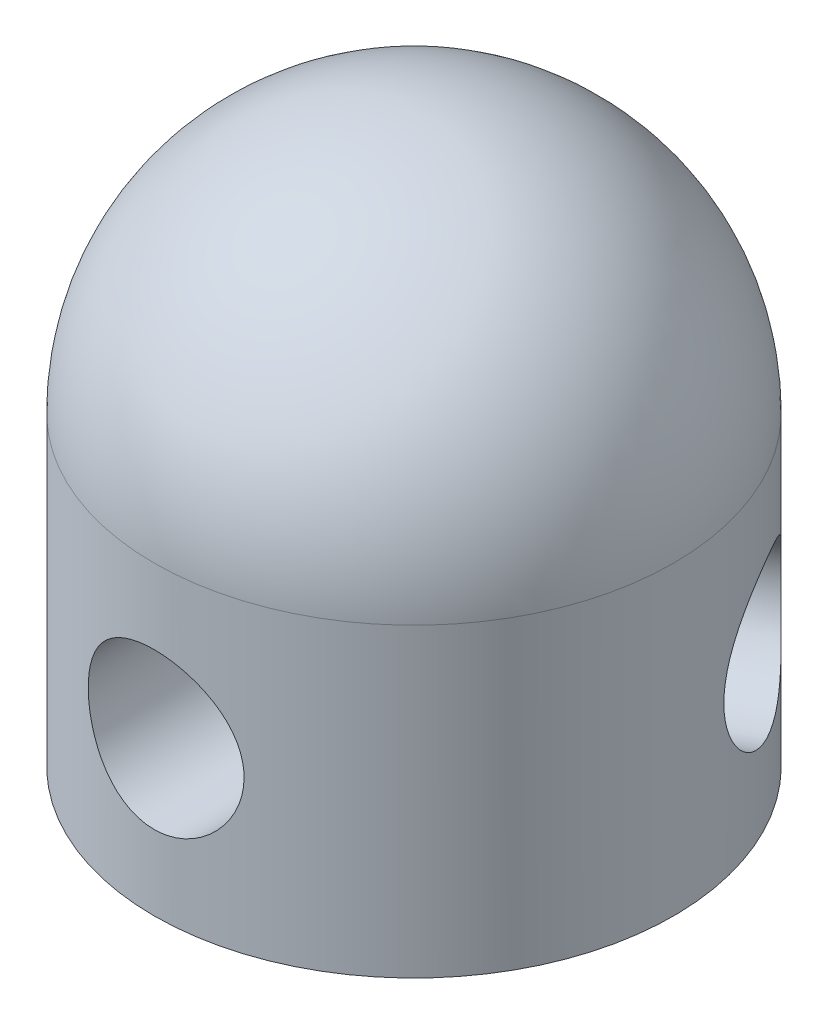
ISO-10303-21;
HEADER;
FILE_DESCRIPTION(('STEP AP214'),'2;1');
FILE_NAME('part.step','',(''),(''),'','','');
FILE_SCHEMA(('AUTOMOTIVE_DESIGN { 1 0 10303 214 1 1 1 1 }'));
ENDSEC;
DATA;
#1=APPLICATION_CONTEXT('core data for automotive mechanical design processes');
#2=APPLICATION_PROTOCOL_DEFINITION('international standard','automotive_design',2000,#1);
#3=PRODUCT_CONTEXT('',#1,'mechanical');
#4=PRODUCT('Part','Part','',(#3));
#5=PRODUCT_RELATED_PRODUCT_CATEGORY('part','',(#4));
#6=PRODUCT_DEFINITION_FORMATION('','',#4);
#7=PRODUCT_DEFINITION_CONTEXT('part definition',#1,'design');
#8=PRODUCT_DEFINITION('design','',#6,#7);
#9=PRODUCT_DEFINITION_SHAPE('','',#8);
#10=(LENGTH_UNIT() NAMED_UNIT(*) SI_UNIT(.MILLI.,.METRE.));
#11=(NAMED_UNIT(*) PLANE_ANGLE_UNIT() SI_UNIT($,.RADIAN.));
#12=(NAMED_UNIT(*) SI_UNIT($,.STERADIAN.) SOLID_ANGLE_UNIT());
#13=UNCERTAINTY_MEASURE_WITH_UNIT(LENGTH_MEASURE(1.E-05),#10,'distance_accuracy_value','');
#14=(GEOMETRIC_REPRESENTATION_CONTEXT(3) GLOBAL_UNCERTAINTY_ASSIGNED_CONTEXT((#13)) GLOBAL_UNIT_ASSIGNED_CONTEXT((#10,
#11,#12)) REPRESENTATION_CONTEXT('',''));
#15=CARTESIAN_POINT('',(0.,0.,0.));
#16=DIRECTION('',(0.,0.,1.));
#17=DIRECTION('',(1.,0.,0.));
#18=AXIS2_PLACEMENT_3D('',#15,#16,#17);
#19=CARTESIAN_POINT('',(0.,20.,0.));
#20=DIRECTION('',(0.,-1.,0.));
#21=DIRECTION('',(0.,0.,-1.));
#22=AXIS2_PLACEMENT_3D('',#19,#20,#21);
#23=CYLINDRICAL_SURFACE('',#22,17.);
#24=CARTESIAN_POINT('',(11.4943048955795,10.,-12.5252127713447));
#25=CARTESIAN_POINT('',(11.4943091391889,9.72053853699297,-12.5252112025164));
#26=CARTESIAN_POINT('',(11.5121535043202,9.44104263790955,-12.5089037602181));
#27=CARTESIAN_POINT('',(11.582323652573,8.89022215138816,-12.4439542886179));
#28=CARTESIAN_POINT('',(11.6346609568794,8.61890032589522,-12.3953014553984));
#29=CARTESIAN_POINT('',(11.7703119951408,8.09248192387591,-12.266556572506));
#30=CARTESIAN_POINT('',(11.8535742009086,7.83735917924745,-12.1865168085596));
#31=CARTESIAN_POINT('',(12.046230903556,7.34928542441603,-11.996107448568));
#32=CARTESIAN_POINT('',(12.1556293122564,7.11633774047292,-11.8857333119874));
#33=CARTESIAN_POINT('',(12.3983275906579,6.67185427203691,-11.6324133127298));
#34=CARTESIAN_POINT('',(12.5322228461527,6.46112394698262,-11.4886242638794));
#35=CARTESIAN_POINT('',(12.815100635476,6.07423096550347,-11.1722052069468));
#36=CARTESIAN_POINT('',(12.9640851049248,5.89807275247041,-10.9995714968672));
#37=CARTESIAN_POINT('',(13.2735846955966,5.58182682056676,-10.6241355000564));
#38=CARTESIAN_POINT('',(13.4342745533065,5.44256035689445,-10.4207831661269));
#39=CARTESIAN_POINT('',(13.757182796132,5.20944331925463,-9.99060207069339));
#40=CARTESIAN_POINT('',(13.9194008438892,5.11558295048468,-9.7637783851526));
#41=CARTESIAN_POINT('',(14.2339950457867,4.97860799629227,-9.29891731425782));
#42=CARTESIAN_POINT('',(14.3865199937958,4.93411856598081,-9.06138632775509));
#43=CARTESIAN_POINT('',(14.6810757235563,4.89280109620211,-8.57592863912629));
#44=CARTESIAN_POINT('',(14.8231087031818,4.89596304603335,-8.32800413140644));
#45=CARTESIAN_POINT('',(15.0881298736171,4.94893575304626,-7.83732552729773));
#46=CARTESIAN_POINT('',(15.2115805337236,4.99725765895348,-7.59465822612114));
#47=CARTESIAN_POINT('',(15.4422263749425,5.13674654238066,-7.11398284027728));
#48=CARTESIAN_POINT('',(15.5494205260546,5.22791623320535,-6.87597505166461));
#49=CARTESIAN_POINT('',(15.7476518826786,5.45152087962283,-6.40910186640061));
#50=CARTESIAN_POINT('',(15.8384863646027,5.58442408954371,-6.18037523951549));
#51=CARTESIAN_POINT('',(16.0026345620649,5.88735269825698,-5.74199944763631));
#52=CARTESIAN_POINT('',(16.075944112242,6.0573869040796,-5.53235482540923));
#53=CARTESIAN_POINT('',(16.2085898798231,6.43747235255154,-5.13108424221061));
#54=CARTESIAN_POINT('',(16.2672785082069,6.64881352468632,-4.94046440445144));
#55=CARTESIAN_POINT('',(16.3685948428311,7.10153406084096,-4.5936727163767));
#56=CARTESIAN_POINT('',(16.4112209532096,7.34291640637865,-4.43750428955632));
#57=CARTESIAN_POINT('',(16.4826112226964,7.85201419540269,-4.16457733711507));
#58=CARTESIAN_POINT('',(16.5112385376736,8.11995995574973,-4.04821107964877));
#59=CARTESIAN_POINT('',(16.5556782401713,8.67266450852361,-3.86247882302972));
#60=CARTESIAN_POINT('',(16.5714948085423,8.95741778315959,-3.79309749132657));
#61=CARTESIAN_POINT('',(16.5910583743358,9.52428002655414,-3.70657371426142));
#62=CARTESIAN_POINT('',(16.59523326391,9.8060919612504,-3.68758057334801));
#63=CARTESIAN_POINT('',(16.5930351099663,10.3688078600227,-3.69746122350779));
#64=CARTESIAN_POINT('',(16.5866635429618,10.649711945682,-3.72632831410652));
#65=CARTESIAN_POINT('',(16.5632399278289,11.1950604851038,-3.82906088886021));
#66=CARTESIAN_POINT('',(16.5464696445532,11.4597429584967,-3.90173789226828));
#67=CARTESIAN_POINT('',(16.5014964165414,11.97336574877,-4.08775140933676));
#68=CARTESIAN_POINT('',(16.4732917065157,12.2223036280777,-4.20109420082303));
#69=CARTESIAN_POINT('',(16.403105234614,12.7047593778455,-4.46738511332275));
#70=CARTESIAN_POINT('',(16.3607740180636,12.9376840513517,-4.62131458230898));
#71=CARTESIAN_POINT('',(16.2608526581479,13.3749695610147,-4.96145500568997));
#72=CARTESIAN_POINT('',(16.2032588611629,13.5793235398835,-5.147673685915));
#73=CARTESIAN_POINT('',(16.0687310107979,13.9616133797701,-5.55366855741561));
#74=CARTESIAN_POINT('',(15.991149080423,14.1382611385557,-5.77444598558341));
#75=CARTESIAN_POINT('',(15.8166685958073,14.4504867834944,-6.23649630449087));
#76=CARTESIAN_POINT('',(15.7197710012639,14.586066709257,-6.47776817662381));
#77=CARTESIAN_POINT('',(15.5073858628341,14.8110001039322,-6.97082578529305));
#78=CARTESIAN_POINT('',(15.3920460137217,14.9006988549405,-7.22251710469358));
#79=CARTESIAN_POINT('',(15.1437121781149,15.0322071242274,-7.72965570488983));
#80=CARTESIAN_POINT('',(15.0107232548554,15.0740303442246,-7.98510188985502));
#81=CARTESIAN_POINT('',(14.7356999073447,15.1075583497853,-8.48154407292581));
#82=CARTESIAN_POINT('',(14.5942110476232,15.1011311643867,-8.72271771670226));
#83=CARTESIAN_POINT('',(14.3021457670378,15.0428064495029,-9.19377085785793));
#84=CARTESIAN_POINT('',(14.1515698618854,14.9909114981663,-9.42365099482983));
#85=CARTESIAN_POINT('',(13.8483022354747,14.8442803512415,-9.8638363779501));
#86=CARTESIAN_POINT('',(13.6956505980359,14.7500101857942,-10.0743253187337));
#87=CARTESIAN_POINT('',(13.392374428475,14.5217214906747,-10.4741271825936));
#88=CARTESIAN_POINT('',(13.2417502337292,14.3876964290238,-10.6634366186995));
#89=CARTESIAN_POINT('',(12.9437875378919,14.0787302447412,-11.0233720182528));
#90=CARTESIAN_POINT('',(12.7967083829254,13.9026171380099,-11.1932063417015));
#91=CARTESIAN_POINT('',(12.5175726784085,13.516584679656,-11.5045286642304));
#92=CARTESIAN_POINT('',(12.385520474445,13.3066555910995,-11.6460084725343));
#93=CARTESIAN_POINT('',(12.1392442729903,12.8514413537876,-11.9025784357291));
#94=CARTESIAN_POINT('',(12.025668937567,12.6052889186445,-12.0167563849168));
#95=CARTESIAN_POINT('',(11.8278644036053,12.089112408027,-12.2115111351694));
#96=CARTESIAN_POINT('',(11.7436211060987,11.8190998798043,-12.2921040831426));
#97=CARTESIAN_POINT('',(11.6171088445098,11.2928825325027,-12.4116687818066));
#98=CARTESIAN_POINT('',(11.5712921039912,11.038330600425,-12.4541926960258));
#99=CARTESIAN_POINT('',(11.5098911761672,10.522528243524,-12.5109625896933));
#100=CARTESIAN_POINT('',(11.4943009280674,10.2612791722088,-12.5252142381021));
#101=CARTESIAN_POINT('',(11.4943048955795,10.,-12.5252127713447));
#102=B_SPLINE_CURVE_WITH_KNOTS('',3,(#24,#25,#26,#27,#28,#29,#30,#31,#32,#33,#34,#35,#36,#37,
#38,#39,#40,#41,#42,#43,#44,#45,#46,#47,#48,#49,#50,#51,#52,#53,#54,#55,#56,#57,#58,#59,#60,#61,
#62,#63,#64,#65,#66,#67,#68,#69,#70,#71,#72,#73,#74,#75,#76,#77,#78,#79,#80,#81,#82,#83,#84,#85,
#86,#87,#88,#89,#90,#91,#92,#93,#94,#95,#96,#97,#98,#99,#100,#101),.UNSPECIFIED.,.T.,.F.,(4,2,2,
2,2,2,2,2,2,2,2,2,2,2,2,2,2,2,2,2,2,2,2,2,2,2,2,2,2,2,2,2,2,2,2,2,2,2,4),(0.,0.837420564112846,
1.6751209817426,2.51143180918506,3.34786788625834,4.20828710027145,5.06881682762327,
5.94714193530391,6.82527748998782,7.67829276508496,8.53112883944897,9.35680428368992,
10.1825320202728,11.017877117413,11.8534205640882,12.7211729987914,13.5890116247233,
14.4651721004139,15.3410465214545,16.1842747469591,17.0273849297397,17.8485922280083,
18.6699263556453,19.5133048816078,20.3568854816719,21.232303207509,22.1076774491114,
22.9763633217756,23.8448005190257,24.67979433307,25.5147408037122,26.340721293744,
27.1668375727954,28.0193873199412,28.8721829895048,29.7503957488581,30.6281857949063,
31.4112792312854,32.1942156312732),.UNSPECIFIED.);
#103=CARTESIAN_POINT('',(11.4943048955795,10.,-12.5252127713447));
#104=VERTEX_POINT('',#103);
#105=EDGE_CURVE('E10',#104,#104,#102,.T.);
#106=ORIENTED_EDGE('',*,*,#105,.T.);
#107=EDGE_LOOP('',(#106));
#108=FACE_BOUND('',#107,.T.);
#109=CARTESIAN_POINT('',(-16.5943048955796,10.,-3.69175365274325));
#110=CARTESIAN_POINT('',(-16.5943056587391,9.72053853699297,-3.6917581122309));
#111=CARTESIAN_POINT('',(-16.5891051820037,9.44104263790955,-3.71536550689819));
#112=CARTESIAN_POINT('',(-16.5679423637619,8.89022215138816,-3.8086093736725));
#113=CARTESIAN_POINT('',(-16.551976426381,8.61890032589522,-3.87826122537722));
#114=CARTESIAN_POINT('',(-16.5083056063196,8.09248192387591,-4.06011091200761));
#115=CARTESIAN_POINT('',(-16.480620240313,7.83735917924745,-4.17223797935077));
#116=CARTESIAN_POINT('',(-16.4120492487656,7.34928542441603,-4.43428825804859));
#117=CARTESIAN_POINT('',(-16.3711616469163,7.11633774047293,-4.58421712740701));
#118=CARTESIAN_POINT('',(-16.2731292314733,6.67185427203691,-4.92106000158624));
#119=CARTESIAN_POINT('',(-16.2155518901302,6.46112394698262,-5.10891121871617));
#120=CARTESIAN_POINT('',(-16.0829638432467,6.07423096550347,-5.51210009890282));
#121=CARTESIAN_POINT('',(-16.0079508994927,5.89807275247041,-5.72744128925463));
#122=CARTESIAN_POINT('',(-15.8375635840953,5.58182682056676,-6.18319379564274));
#123=CARTESIAN_POINT('',(-15.7418002258484,5.44256035689445,-6.42403146151478));
#124=CARTESIAN_POINT('',(-15.5307065903879,5.20944331925463,-6.9187687506098));
#125=CARTESIAN_POINT('',(-15.4153805404082,5.11558295048467,-7.17266554369019));
#126=CARTESIAN_POINT('',(-15.1700961447316,4.97860799629227,-7.67754264986412));
#127=CARTESIAN_POINT('',(-15.0406507502388,4.93411856598081,-7.92839862280228));
#128=CARTESIAN_POINT('',(-14.767509924304,4.89280109620211,-8.42622021191952));
#129=CARTESIAN_POINT('',(-14.6238174922107,4.89596304603335,-8.6731866343104));
#130=CARTESIAN_POINT('',(-14.3313879411767,4.94893575304626,-9.14804100250239));
#131=CARTESIAN_POINT('',(-14.1829572237432,4.99725765895349,-9.37628606085688));
#132=CARTESIAN_POINT('',(-13.882003049238,5.13674654238066,-9.81636891155159));
#133=CARTESIAN_POINT('',(-13.7294793335569,5.22791623320535,-10.0282056638581));
#134=CARTESIAN_POINT('',(-13.4242709730846,5.45152087962283,-10.4333156471532));
#135=CARTESIAN_POINT('',(-13.2716051446422,5.58442408954371,-10.6263439294816));
#136=CARTESIAN_POINT('',(-12.9740346712018,5.88735269825698,-10.9876883344089));
#137=CARTESIAN_POINT('',(-12.8291318776749,6.05738690407959,-11.1559985783158));
#138=CARTESIAN_POINT('',(-12.547944242624,6.43747235255154,-11.4715084743448));
#139=CARTESIAN_POINT('',(-12.4122069348512,6.64881352468632,-11.6176442363181));
#140=CARTESIAN_POINT('',(-12.1625346904693,7.10153406084096,-11.8787825999583));
#141=CARTESIAN_POINT('',(-12.048601920763,7.34291640637865,-11.9937821078208));
#142=CARTESIAN_POINT('',(-11.8479353813149,7.85201419540269,-12.192071371));
#143=CARTESIAN_POINT('',(-11.7614729036943,8.11995995574973,-12.2750464817455));
#144=CARTESIAN_POINT('',(-11.6228439024089,8.67266450852362,-12.4063985213547));
#145=CARTESIAN_POINT('',(-11.5706661907911,8.9574177831596,-12.4547867372163));
#146=CARTESIAN_POINT('',(-11.505516184718,9.52428002655414,-12.5149911707146));
#147=CARTESIAN_POINT('',(-11.4911550869764,9.8060919612504,-12.5281033016006));
#148=CARTESIAN_POINT('',(-11.4986129040488,10.3688078600227,-12.521259319364));
#149=CARTESIAN_POINT('',(-11.5204267543385,10.649711945682,-12.5013078351768));
#150=CARTESIAN_POINT('',(-11.5976839663049,11.1950604851038,-12.4296561020464));
#151=CARTESIAN_POINT('',(-11.6522389558893,11.4597429584967,-12.3787941089969));
#152=CARTESIAN_POINT('',(-11.790844773112,11.97336574877,-12.2468393925143));
#153=CARTESIAN_POINT('',(-11.8749001548621,12.2223036280777,-12.1657420013825));
#154=CARTESIAN_POINT('',(-12.070421613933,12.7047593778455,-11.9718132774638));
#155=CARTESIAN_POINT('',(-12.1825628361909,12.9376840513517,-11.8581886340649));
#156=CARTESIAN_POINT('',(-12.427172403735,13.3749695610147,-11.6015839863068));
#157=CARTESIAN_POINT('',(-12.5596456129766,13.5793235398835,-11.4585969549049));
#158=CARTESIAN_POINT('',(-12.8439835603198,13.9616133797701,-11.1390949832219));
#159=CARTESIAN_POINT('',(-12.9963914565079,14.1382611385557,-10.9615183465587));
#160=CARTESIAN_POINT('',(-13.3092985282005,14.4504867834944,-10.5793886549631));
#161=CARTESIAN_POINT('',(-13.4697973014146,14.586066709257,-10.3748369404565));
#162=CARTESIAN_POINT('',(-13.7906051468365,14.8110001039322,-9.94437721085544));
#163=CARTESIAN_POINT('',(-13.9509062987932,14.9006988549405,-9.71864431175515));
#164=CARTESIAN_POINT('',(-14.2659342919994,15.0322071242274,-9.25001160140225));
#165=CARTESIAN_POINT('',(-14.4206627158493,15.0740303442246,-9.007116722955));
#166=CARTESIAN_POINT('',(-14.7130825841435,15.1075583497853,-8.52071842584154));
#167=CARTESIAN_POINT('',(-14.8512006565164,15.1011311643867,-8.27759865708203));
#168=CARTESIAN_POINT('',(-15.113112002997,15.0428064495029,-7.78913613395382));
#169=CARTESIAN_POINT('',(-15.2369060888638,14.9909114981663,-7.54379350640798));
#170=CARTESIAN_POINT('',(-15.4664839998152,14.8442803512415,-7.06106334623079));
#171=CARTESIAN_POINT('',(-15.5724469510301,14.7500101857942,-6.82361867988773));
#172=CARTESIAN_POINT('',(-15.7670474368327,14.5217214906747,-6.36107288075556));
#173=CARTESIAN_POINT('',(-15.8556821203036,14.3876964290238,-6.13597378362818));
#174=CARTESIAN_POINT('',(-16.0184139721195,14.0787302447412,-5.6979628198763));
#175=CARTESIAN_POINT('',(-16.0919552331773,13.9026171380099,-5.48567137358382));
#176=CARTESIAN_POINT('',(-16.222000420994,13.516584679656,-5.08827160110455));
#177=CARTESIAN_POINT('',(-16.278499427126,13.3066555910995,-4.90317113369443));
#178=CARTESIAN_POINT('',(-16.3775574323734,12.8514413537876,-4.56160470528978));
#179=CARTESIAN_POINT('',(-16.4196507692104,12.6052889186445,-4.40615660497598));
#180=CARTESIAN_POINT('',(-16.4894110634559,12.089112408027,-4.13747547845514));
#181=CARTESIAN_POINT('',(-16.5170849550133,11.8190998798043,-4.02422216872923));
#182=CARTESIAN_POINT('',(-16.5573748906577,11.2928825325027,-3.854876986971));
#183=CARTESIAN_POINT('',(-16.5712933103805,11.038330600425,-3.7939365686537));
#184=CARTESIAN_POINT('',(-16.5897570165548,10.522528243524,-3.71237685850837));
#185=CARTESIAN_POINT('',(-16.5943041820727,10.2612791722088,-3.69174948339829));
#186=CARTESIAN_POINT('',(-16.5943048955796,10.,-3.69175365274325));
#187=B_SPLINE_CURVE_WITH_KNOTS('',3,(#109,#110,#111,#112,#113,#114,#115,#116,#117,#118,#119,
#120,#121,#122,#123,#124,#125,#126,#127,#128,#129,#130,#131,#132,#133,#134,#135,#136,#137,#138,
#139,#140,#141,#142,#143,#144,#145,#146,#147,#148,#149,#150,#151,#152,#153,#154,#155,#156,#157,
#158,#159,#160,#161,#162,#163,#164,#165,#166,#167,#168,#169,#170,#171,#172,#173,#174,#175,#176,
#177,#178,#179,#180,#181,#182,#183,#184,#185,#186),.UNSPECIFIED.,.T.,.F.,(4,2,2,2,2,2,2,2,2,2,2,
2,2,2,2,2,2,2,2,2,2,2,2,2,2,2,2,2,2,2,2,2,2,2,2,2,2,2,4),(0.,0.837420564112844,1.6751209817426,
2.51143180918506,3.34786788625834,4.20828710027145,5.06881682762327,5.94714193530391,
6.82527748998781,7.67829276508496,8.53112883944897,9.35680428368992,10.1825320202728,
11.017877117413,11.8534205640882,12.7211729987914,13.5890116247233,14.4651721004139,
15.3410465214545,16.1842747469591,17.0273849297397,17.8485922280083,18.6699263556453,
19.5133048816078,20.3568854816719,21.232303207509,22.1076774491114,22.9763633217756,
23.8448005190257,24.67979433307,25.5147408037122,26.340721293744,27.1668375727954,
28.0193873199412,28.8721829895048,29.7503957488581,30.6281857949063,31.4112792312854,
32.1942156312733),.UNSPECIFIED.);
#188=CARTESIAN_POINT('',(-16.5943048955796,10.,-3.69175365274325));
#189=VERTEX_POINT('',#188);
#190=EDGE_CURVE('E40',#189,#189,#187,.T.);
#191=ORIENTED_EDGE('',*,*,#190,.T.);
#192=EDGE_LOOP('',(#191));
#193=FACE_BOUND('',#192,.T.);
#194=CARTESIAN_POINT('',(5.1,10.,16.2169664240881));
#195=CARTESIAN_POINT('',(5.09999651955016,9.72053853699297,16.2169693147474));
#196=CARTESIAN_POINT('',(5.07695167768342,9.44104263790955,16.2242692671164));
#197=CARTESIAN_POINT('',(4.98561871118889,8.89022215138816,16.2525636622905));
#198=CARTESIAN_POINT('',(4.91731546950149,8.61890032589522,16.2735626807757));
#199=CARTESIAN_POINT('',(4.73799361117864,8.09248192387591,16.3266674845137));
#200=CARTESIAN_POINT('',(4.62704603940432,7.83735917924745,16.3587547879105));
#201=CARTESIAN_POINT('',(4.36581834520955,7.34928542441603,16.4303957066167));
#202=CARTESIAN_POINT('',(4.21553233465978,7.11633774047293,16.4699504393945));
#203=CARTESIAN_POINT('',(3.87480164081533,6.67185427203691,16.5534733143162));
#204=CARTESIAN_POINT('',(3.68332904397743,6.46112394698262,16.5975354825957));
#205=CARTESIAN_POINT('',(3.26786320777063,6.07423096550347,16.6843053058497));
#206=CARTESIAN_POINT('',(3.04386579456778,5.89807275247041,16.727012786122));
#207=CARTESIAN_POINT('',(2.56397888849855,5.58182682056676,16.8073292956992));
#208=CARTESIAN_POINT('',(2.30752567254177,5.44256035689445,16.8448146276417));
#209=CARTESIAN_POINT('',(1.7735237942558,5.20944331925463,16.9093708213033));
#210=CARTESIAN_POINT('',(1.4959796965189,5.11558295048467,16.9364439288429));
#211=CARTESIAN_POINT('',(0.936101098944822,4.97860799629227,16.976459964122));
#212=CARTESIAN_POINT('',(0.654130756442926,4.93411856598081,16.9897849505574));
#213=CARTESIAN_POINT('',(0.0864342007476682,4.89280109620211,17.0021488510459));
#214=CARTESIAN_POINT('',(-0.199291210971263,4.89596304603335,17.0011907657169));
#215=CARTESIAN_POINT('',(-0.756741932440534,4.94893575304626,16.9853665298002));
#216=CARTESIAN_POINT('',(-1.02862330998052,4.99725765895348,16.9709442869781));
#217=CARTESIAN_POINT('',(-1.56022332570463,5.13674654238066,16.9303517518289));
#218=CARTESIAN_POINT('',(-1.81994119249782,5.22791623320535,16.9041807155228));
#219=CARTESIAN_POINT('',(-2.32338090959421,5.45152087962283,16.8424175135539));
#220=CARTESIAN_POINT('',(-2.56688121996069,5.58442408954371,16.8067191689971));
#221=CARTESIAN_POINT('',(-3.02859989086327,5.88735269825698,16.7296877820452));
#222=CARTESIAN_POINT('',(-3.24681223456726,6.0573869040796,16.688353403725));
#223=CARTESIAN_POINT('',(-3.66064563719922,6.43747235255154,16.6025927165555));
#224=CARTESIAN_POINT('',(-3.85507157335584,6.64881352468632,16.5581086407696));
#225=CARTESIAN_POINT('',(-4.20606015236195,7.10153406084096,16.472455316335));
#226=CARTESIAN_POINT('',(-4.36261903244668,7.34291640637865,16.4312863973771));
#227=CARTESIAN_POINT('',(-4.63467584138169,7.85201419540269,16.3566487081151));
#228=CARTESIAN_POINT('',(-4.74976563397942,8.11995995574973,16.3232575613943));
#229=CARTESIAN_POINT('',(-4.93283433776257,8.67266450852361,16.2688773443844));
#230=CARTESIAN_POINT('',(-5.0008286177514,8.95741778315959,16.2478842285429));
#231=CARTESIAN_POINT('',(-5.08554218961796,9.52428002655414,16.2215648849761));
#232=CARTESIAN_POINT('',(-5.10407817693372,9.8060919612504,16.2156838749486));
#233=CARTESIAN_POINT('',(-5.0944222059176,10.3688078600227,16.2187205428718));
#234=CARTESIAN_POINT('',(-5.0662367886235,10.649711945682,16.2276361492834));
#235=CARTESIAN_POINT('',(-4.96555596152414,11.1950604851038,16.2587169909066));
#236=CARTESIAN_POINT('',(-4.89423068866398,11.4597429584967,16.2805320012652));
#237=CARTESIAN_POINT('',(-4.71065164342951,11.97336574877,16.3345908018511));
#238=CARTESIAN_POINT('',(-4.5983915516537,12.2223036280777,16.3668362022056));
#239=CARTESIAN_POINT('',(-4.33268362068114,12.7047593778455,16.4391983907866));
#240=CARTESIAN_POINT('',(-4.17821118187282,12.9376840513517,16.4795032163739));
#241=CARTESIAN_POINT('',(-3.83368025441304,13.3749695610147,16.5630389919968));
#242=CARTESIAN_POINT('',(-3.64361324818647,13.5793235398835,16.6062706408199));
#243=CARTESIAN_POINT('',(-3.22474745047824,13.9616133797701,16.6927635406376));
#244=CARTESIAN_POINT('',(-2.99475762391528,14.1382611385557,16.7359643321422));
#245=CARTESIAN_POINT('',(-2.50737006760684,14.4504867834944,16.8158849594541));
#246=CARTESIAN_POINT('',(-2.24997369984941,14.586066709257,16.8526051170804));
#247=CARTESIAN_POINT('',(-1.71678071599776,14.8110001039322,16.9152029961486));
#248=CARTESIAN_POINT('',(-1.44113971492866,14.9006988549405,16.9411614164488));
#249=CARTESIAN_POINT('',(-0.877777886115598,15.0322071242274,16.9796673062921));
#250=CARTESIAN_POINT('',(-0.590060539006182,15.0740303442246,16.9922186128101));
#251=CARTESIAN_POINT('',(-0.0226173232013399,15.1075583497853,17.0022624987674));
#252=CARTESIAN_POINT('',(0.256989608893054,15.1011311643867,17.0003163737844));
#253=CARTESIAN_POINT('',(0.810966235959017,15.0428064495029,16.9829069918118));
#254=CARTESIAN_POINT('',(1.08533622697837,14.9909114981663,16.9674445012379));
#255=CARTESIAN_POINT('',(1.61818176434044,14.8442803512415,16.924899724181));
#256=CARTESIAN_POINT('',(1.8767963529941,14.7500101857942,16.8979439986215));
#257=CARTESIAN_POINT('',(2.37467300835761,14.5217214906747,16.8352000633492));
#258=CARTESIAN_POINT('',(2.61393188657432,14.3876964290238,16.7994104023277));
#259=CARTESIAN_POINT('',(3.07462643422749,14.0787302447412,16.7213348381292));
#260=CARTESIAN_POINT('',(3.29524685025182,13.9026171380099,16.6788777152854));
#261=CARTESIAN_POINT('',(3.7044277425854,13.516584679656,16.592800265335));
#262=CARTESIAN_POINT('',(3.89297895268092,13.3066555910995,16.5491796062288));
#263=CARTESIAN_POINT('',(4.23831315938298,12.8514413537876,16.464183141019));
#264=CARTESIAN_POINT('',(4.39398183164325,12.6052889186445,16.4229129898929));
#265=CARTESIAN_POINT('',(4.66154665985047,12.089112408027,16.3489866136246));
#266=CARTESIAN_POINT('',(4.77346384891446,11.8190998798043,16.3163262518719));
#267=CARTESIAN_POINT('',(4.94026604614778,11.2928825325027,16.2665457687777));
#268=CARTESIAN_POINT('',(5.00000120638926,11.038330600425,16.2481292646796));
#269=CARTESIAN_POINT('',(5.07986584038751,10.522528243524,16.2233394482018));
#270=CARTESIAN_POINT('',(5.1000032540052,10.2612791722088,16.2169637215005));
#271=CARTESIAN_POINT('',(5.1,10.,16.2169664240881));
#272=B_SPLINE_CURVE_WITH_KNOTS('',3,(#194,#195,#196,#197,#198,#199,#200,#201,#202,#203,#204,
#205,#206,#207,#208,#209,#210,#211,#212,#213,#214,#215,#216,#217,#218,#219,#220,#221,#222,#223,
#224,#225,#226,#227,#228,#229,#230,#231,#232,#233,#234,#235,#236,#237,#238,#239,#240,#241,#242,
#243,#244,#245,#246,#247,#248,#249,#250,#251,#252,#253,#254,#255,#256,#257,#258,#259,#260,#261,
#262,#263,#264,#265,#266,#267,#268,#269,#270,#271),.UNSPECIFIED.,.T.,.F.,(4,2,2,2,2,2,2,2,2,2,2,
2,2,2,2,2,2,2,2,2,2,2,2,2,2,2,2,2,2,2,2,2,2,2,2,2,2,2,4),(0.,0.837420564112844,1.6751209817426,
2.51143180918506,3.34786788625834,4.20828710027145,5.06881682762327,5.94714193530391,
6.82527748998782,7.67829276508496,8.53112883944897,9.35680428368992,10.1825320202728,
11.017877117413,11.8534205640882,12.7211729987914,13.5890116247233,14.4651721004139,
15.3410465214545,16.1842747469591,17.0273849297397,17.8485922280083,18.6699263556453,
19.5133048816078,20.3568854816719,21.232303207509,22.1076774491114,22.9763633217756,
23.8448005190257,24.67979433307,25.5147408037122,26.340721293744,27.1668375727954,
28.0193873199412,28.8721829895048,29.7503957488581,30.6281857949063,31.4112792312854,
32.1942156312732),.UNSPECIFIED.);
#273=CARTESIAN_POINT('',(5.1,10.,16.2169664240881));
#274=VERTEX_POINT('',#273);
#275=EDGE_CURVE('E44',#274,#274,#272,.T.);
#276=ORIENTED_EDGE('',*,*,#275,.T.);
#277=EDGE_LOOP('',(#276));
#278=FACE_BOUND('',#277,.T.);
#279=CARTESIAN_POINT('',(0.,20.,0.));
#280=DIRECTION('',(0.,1.,0.));
#281=DIRECTION('',(0.,0.,1.));
#282=AXIS2_PLACEMENT_3D('',#279,#280,#281);
#283=CIRCLE('',#282,17.);
#284=CARTESIAN_POINT('',(0.,20.,17.));
#285=VERTEX_POINT('',#284);
#286=EDGE_CURVE('E86',#285,#285,#283,.T.);
#287=ORIENTED_EDGE('',*,*,#286,.F.);
#288=EDGE_LOOP('',(#287));
#289=FACE_BOUND('',#288,.T.);
#290=CARTESIAN_POINT('',(0.,0.,0.));
#291=DIRECTION('',(0.,1.,0.));
#292=DIRECTION('',(0.,0.,1.));
#293=AXIS2_PLACEMENT_3D('',#290,#291,#292);
#294=CIRCLE('',#293,17.);
#295=CARTESIAN_POINT('',(0.,0.,17.));
#296=VERTEX_POINT('',#295);
#297=EDGE_CURVE('E87',#296,#296,#294,.T.);
#298=ORIENTED_EDGE('',*,*,#297,.T.);
#299=EDGE_LOOP('',(#298));
#300=FACE_BOUND('',#299,.T.);
#301=ADVANCED_FACE('F32',(#108,#193,#278,#289,#300),#23,.T.);
#302=CARTESIAN_POINT('',(0.,0.,0.));
#303=DIRECTION('',(0.,1.,0.));
#304=DIRECTION('',(0.,0.,1.));
#305=AXIS2_PLACEMENT_3D('',#302,#303,#304);
#306=PLANE('',#305);
#307=CARTESIAN_POINT('',(0.,0.,0.));
#308=DIRECTION('',(0.,-1.,0.));
#309=DIRECTION('',(0.,0.,-1.));
#310=AXIS2_PLACEMENT_3D('',#307,#308,#309);
#311=CIRCLE('',#310,13.5);
#312=CARTESIAN_POINT('',(0.,0.,-13.5));
#313=VERTEX_POINT('',#312);
#314=EDGE_CURVE('E102',#313,#313,#311,.T.);
#315=ORIENTED_EDGE('',*,*,#314,.F.);
#316=EDGE_LOOP('',(#315));
#317=FACE_BOUND('',#316,.T.);
#318=ORIENTED_EDGE('',*,*,#297,.F.);
#319=EDGE_LOOP('',(#318));
#320=FACE_BOUND('',#319,.T.);
#321=ADVANCED_FACE('F136',(#317,#320),#306,.F.);
#322=CARTESIAN_POINT('',(0.,20.,0.));
#323=DIRECTION('',(0.,-1.,0.));
#324=DIRECTION('',(-1.,0.,0.));
#325=AXIS2_PLACEMENT_3D('',#322,#323,#324);
#326=SPHERICAL_SURFACE('',#325,17.);
#327=ORIENTED_EDGE('',*,*,#286,.T.);
#328=EDGE_LOOP('',(#327));
#329=FACE_BOUND('',#328,.T.);
#330=ADVANCED_FACE('F79',(#329),#326,.T.);
#331=CARTESIAN_POINT('',(0.,10.,7.));
#332=DIRECTION('',(0.,0.,1.));
#333=DIRECTION('',(1.,0.,0.));
#334=AXIS2_PLACEMENT_3D('',#331,#332,#333);
#335=CYLINDRICAL_SURFACE('',#334,5.1);
#336=CARTESIAN_POINT('',(0.,10.,7.));
#337=DIRECTION('',(0.,0.,1.));
#338=DIRECTION('',(1.,0.,0.));
#339=AXIS2_PLACEMENT_3D('',#336,#337,#338);
#340=CIRCLE('',#339,5.1);
#341=CARTESIAN_POINT('',(5.1,10.,7.));
#342=VERTEX_POINT('',#341);
#343=EDGE_CURVE('E90',#342,#342,#340,.T.);
#344=ORIENTED_EDGE('',*,*,#343,.F.);
#345=EDGE_LOOP('',(#344));
#346=FACE_BOUND('',#345,.T.);
#347=ORIENTED_EDGE('',*,*,#275,.F.);
#348=EDGE_LOOP('',(#347));
#349=FACE_BOUND('',#348,.T.);
#350=ADVANCED_FACE('F74',(#346,#349),#335,.F.);
#351=CARTESIAN_POINT('',(0.,10.,7.));
#352=DIRECTION('',(0.,0.,1.));
#353=DIRECTION('',(1.,0.,0.));
#354=AXIS2_PLACEMENT_3D('',#351,#352,#353);
#355=PLANE('',#354);
#356=ORIENTED_EDGE('',*,*,#343,.T.);
#357=EDGE_LOOP('',(#356));
#358=FACE_BOUND('',#357,.T.);
#359=ADVANCED_FACE('F70',(#358),#355,.T.);
#360=CARTESIAN_POINT('',(-6.0621778264911,10.,-3.49999999999994));
#361=DIRECTION('',(-0.866025403784443,0.,-0.499999999999992));
#362=DIRECTION('',(-0.499999999999992,0.,0.866025403784443));
#363=AXIS2_PLACEMENT_3D('',#360,#361,#362);
#364=CYLINDRICAL_SURFACE('',#363,5.1);
#365=CARTESIAN_POINT('',(-6.0621778264911,10.,-3.49999999999994));
#366=DIRECTION('',(-0.866025403784443,0.,-0.499999999999992));
#367=DIRECTION('',(-0.499999999999992,0.,0.866025403784443));
#368=AXIS2_PLACEMENT_3D('',#365,#366,#367);
#369=CIRCLE('',#368,5.1);
#370=CARTESIAN_POINT('',(-8.61217782649106,10.,0.916729559300716));
#371=VERTEX_POINT('',#370);
#372=EDGE_CURVE('E96',#371,#371,#369,.T.);
#373=ORIENTED_EDGE('',*,*,#372,.F.);
#374=EDGE_LOOP('',(#373));
#375=FACE_BOUND('',#374,.T.);
#376=ORIENTED_EDGE('',*,*,#190,.F.);
#377=EDGE_LOOP('',(#376));
#378=FACE_BOUND('',#377,.T.);
#379=ADVANCED_FACE('F65',(#375,#378),#364,.F.);
#380=CARTESIAN_POINT('',(-6.0621778264911,10.,-3.49999999999994));
#381=DIRECTION('',(-0.866025403784443,0.,-0.499999999999992));
#382=DIRECTION('',(-0.499999999999992,0.,0.866025403784443));
#383=AXIS2_PLACEMENT_3D('',#380,#381,#382);
#384=PLANE('',#383);
#385=ORIENTED_EDGE('',*,*,#372,.T.);
#386=EDGE_LOOP('',(#385));
#387=FACE_BOUND('',#386,.T.);
#388=ADVANCED_FACE('F61',(#387),#384,.T.);
#389=CARTESIAN_POINT('',(6.06217782649106,10.,-3.50000000000003));
#390=DIRECTION('',(0.866025403784436,0.,-0.500000000000004));
#391=DIRECTION('',(-0.500000000000004,0.,-0.866025403784436));
#392=AXIS2_PLACEMENT_3D('',#389,#390,#391);
#393=CYLINDRICAL_SURFACE('',#392,5.1);
#394=CARTESIAN_POINT('',(6.06217782649106,10.,-3.50000000000003));
#395=DIRECTION('',(0.866025403784436,0.,-0.500000000000004));
#396=DIRECTION('',(-0.500000000000004,0.,-0.866025403784436));
#397=AXIS2_PLACEMENT_3D('',#394,#395,#396);
#398=CIRCLE('',#397,5.1);
#399=CARTESIAN_POINT('',(3.51217782649104,10.,-7.91672955930065));
#400=VERTEX_POINT('',#399);
#401=EDGE_CURVE('E95',#400,#400,#398,.T.);
#402=ORIENTED_EDGE('',*,*,#401,.F.);
#403=EDGE_LOOP('',(#402));
#404=FACE_BOUND('',#403,.T.);
#405=ORIENTED_EDGE('',*,*,#105,.F.);
#406=EDGE_LOOP('',(#405));
#407=FACE_BOUND('',#406,.T.);
#408=ADVANCED_FACE('F55',(#404,#407),#393,.F.);
#409=CARTESIAN_POINT('',(6.06217782649106,10.,-3.50000000000003));
#410=DIRECTION('',(0.866025403784436,0.,-0.500000000000004));
#411=DIRECTION('',(-0.500000000000004,0.,-0.866025403784436));
#412=AXIS2_PLACEMENT_3D('',#409,#410,#411);
#413=PLANE('',#412);
#414=ORIENTED_EDGE('',*,*,#401,.T.);
#415=EDGE_LOOP('',(#414));
#416=FACE_BOUND('',#415,.T.);
#417=ADVANCED_FACE('F60',(#416),#413,.T.);
#418=CARTESIAN_POINT('',(0.,3.,0.));
#419=DIRECTION('',(0.,-1.,0.));
#420=DIRECTION('',(0.,0.,-1.));
#421=AXIS2_PLACEMENT_3D('',#418,#419,#420);
#422=CYLINDRICAL_SURFACE('',#421,13.5);
#423=CARTESIAN_POINT('',(0.,3.,0.));
#424=DIRECTION('',(0.,-1.,0.));
#425=DIRECTION('',(0.,0.,-1.));
#426=AXIS2_PLACEMENT_3D('',#423,#424,#425);
#427=CIRCLE('',#426,13.5);
#428=CARTESIAN_POINT('',(0.,3.,-13.5));
#429=VERTEX_POINT('',#428);
#430=EDGE_CURVE('E99',#429,#429,#427,.T.);
#431=ORIENTED_EDGE('',*,*,#430,.F.);
#432=EDGE_LOOP('',(#431));
#433=FACE_BOUND('',#432,.T.);
#434=ORIENTED_EDGE('',*,*,#314,.T.);
#435=EDGE_LOOP('',(#434));
#436=FACE_BOUND('',#435,.T.);
#437=ADVANCED_FACE('F182',(#433,#436),#422,.F.);
#438=CARTESIAN_POINT('',(0.,3.,0.));
#439=DIRECTION('',(0.,-1.,0.));
#440=DIRECTION('',(0.,0.,-1.));
#441=AXIS2_PLACEMENT_3D('',#438,#439,#440);
#442=PLANE('',#441);
#443=CARTESIAN_POINT('',(0.,3.,0.));
#444=DIRECTION('',(0.,-1.,0.));
#445=DIRECTION('',(0.,0.,-1.));
#446=AXIS2_PLACEMENT_3D('',#443,#444,#445);
#447=CIRCLE('',#446,3.);
#448=CARTESIAN_POINT('',(0.,3.,-3.));
#449=VERTEX_POINT('',#448);
#450=EDGE_CURVE('E110',#449,#449,#447,.T.);
#451=ORIENTED_EDGE('',*,*,#450,.F.);
#452=EDGE_LOOP('',(#451));
#453=FACE_BOUND('',#452,.T.);
#454=ORIENTED_EDGE('',*,*,#430,.T.);
#455=EDGE_LOOP('',(#454));
#456=FACE_BOUND('',#455,.T.);
#457=ADVANCED_FACE('F189',(#453,#456),#442,.T.);
#458=CARTESIAN_POINT('',(0.,5.,0.));
#459=DIRECTION('',(0.,-1.,0.));
#460=DIRECTION('',(0.,0.,-1.));
#461=AXIS2_PLACEMENT_3D('',#458,#459,#460);
#462=PLANE('',#461);
#463=CARTESIAN_POINT('',(0.,5.,0.));
#464=DIRECTION('',(0.,-1.,0.));
#465=DIRECTION('',(0.,0.,-1.));
#466=AXIS2_PLACEMENT_3D('',#463,#464,#465);
#467=CIRCLE('',#466,3.);
#468=CARTESIAN_POINT('',(0.,5.,-3.));
#469=VERTEX_POINT('',#468);
#470=EDGE_CURVE('E113',#469,#469,#467,.T.);
#471=ORIENTED_EDGE('',*,*,#470,.T.);
#472=EDGE_LOOP('',(#471));
#473=FACE_BOUND('',#472,.T.);
#474=CARTESIAN_POINT('',(0.,5.,0.));
#475=DIRECTION('',(0.,-1.,0.));
#476=DIRECTION('',(0.,0.,-1.));
#477=AXIS2_PLACEMENT_3D('',#474,#475,#476);
#478=CIRCLE('',#477,2.);
#479=CARTESIAN_POINT('',(0.,5.,-2.));
#480=VERTEX_POINT('',#479);
#481=EDGE_CURVE('E36',#480,#480,#478,.F.);
#482=ORIENTED_EDGE('',*,*,#481,.T.);
#483=EDGE_LOOP('',(#482));
#484=FACE_BOUND('',#483,.T.);
#485=ADVANCED_FACE('F120',(#473,#484),#462,.T.);
#486=CARTESIAN_POINT('',(0.,5.,0.));
#487=DIRECTION('',(0.,-1.,0.));
#488=DIRECTION('',(0.,0.,-1.));
#489=AXIS2_PLACEMENT_3D('',#486,#487,#488);
#490=CYLINDRICAL_SURFACE('',#489,3.);
#491=ORIENTED_EDGE('',*,*,#470,.F.);
#492=EDGE_LOOP('',(#491));
#493=FACE_BOUND('',#492,.T.);
#494=ORIENTED_EDGE('',*,*,#450,.T.);
#495=EDGE_LOOP('',(#494));
#496=FACE_BOUND('',#495,.T.);
#497=ADVANCED_FACE('F130',(#493,#496),#490,.F.);
#498=CARTESIAN_POINT('',(0.,11.,0.));
#499=DIRECTION('',(0.,-1.,0.));
#500=DIRECTION('',(0.,0.,-1.));
#501=AXIS2_PLACEMENT_3D('',#498,#499,#500);
#502=PLANE('',#501);
#503=CARTESIAN_POINT('',(0.,11.,0.));
#504=DIRECTION('',(0.,-1.,0.));
#505=DIRECTION('',(0.,0.,-1.));
#506=AXIS2_PLACEMENT_3D('',#503,#504,#505);
#507=CIRCLE('',#506,2.);
#508=CARTESIAN_POINT('',(0.,11.,-2.));
#509=VERTEX_POINT('',#508);
#510=EDGE_CURVE('E105',#509,#509,#507,.T.);
#511=ORIENTED_EDGE('',*,*,#510,.T.);
#512=EDGE_LOOP('',(#511));
#513=FACE_BOUND('',#512,.T.);
#514=ADVANCED_FACE('F124',(#513),#502,.T.);
#515=CARTESIAN_POINT('',(0.,11.,0.));
#516=DIRECTION('',(0.,-1.,0.));
#517=DIRECTION('',(0.,0.,-1.));
#518=AXIS2_PLACEMENT_3D('',#515,#516,#517);
#519=CYLINDRICAL_SURFACE('',#518,2.);
#520=ORIENTED_EDGE('',*,*,#510,.F.);
#521=EDGE_LOOP('',(#520));
#522=FACE_BOUND('',#521,.T.);
#523=ORIENTED_EDGE('',*,*,#481,.F.);
#524=EDGE_LOOP('',(#523));
#525=FACE_BOUND('',#524,.T.);
#526=ADVANCED_FACE('F122',(#522,#525),#519,.F.);
#527=CLOSED_SHELL('',(#301,#321,#330,#350,#359,#379,#388,#408,#417,#437,#457,#485,#497,#514,#526));
#528=MANIFOLD_SOLID_BREP('B2',#527);
#529=ADVANCED_BREP_SHAPE_REPRESENTATION('',(#18,#528),#14);
#530=SHAPE_DEFINITION_REPRESENTATION(#9,#529);
ENDSEC;
END-ISO-10303-21;
